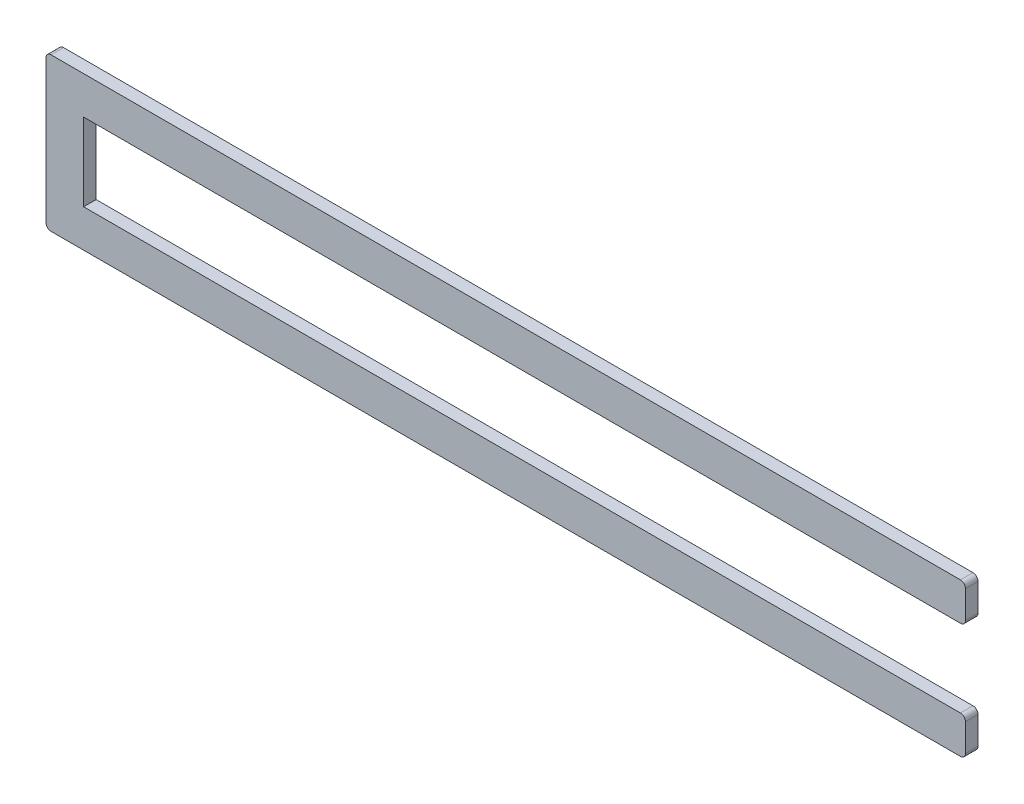
ISO-10303-21;
HEADER;
FILE_DESCRIPTION(('STEP AP214'),'2;1');
FILE_NAME('part.step','',(''),(''),'','','');
FILE_SCHEMA(('AUTOMOTIVE_DESIGN { 1 0 10303 214 1 1 1 1 }'));
ENDSEC;
DATA;
#1=APPLICATION_CONTEXT('core data for automotive mechanical design processes');
#2=APPLICATION_PROTOCOL_DEFINITION('international standard','automotive_design',2000,#1);
#3=PRODUCT_CONTEXT('',#1,'mechanical');
#4=PRODUCT('Part','Part','',(#3));
#5=PRODUCT_RELATED_PRODUCT_CATEGORY('part','',(#4));
#6=PRODUCT_DEFINITION_FORMATION('','',#4);
#7=PRODUCT_DEFINITION_CONTEXT('part definition',#1,'design');
#8=PRODUCT_DEFINITION('design','',#6,#7);
#9=PRODUCT_DEFINITION_SHAPE('','',#8);
#10=(LENGTH_UNIT() NAMED_UNIT(*) SI_UNIT(.MILLI.,.METRE.));
#11=(NAMED_UNIT(*) PLANE_ANGLE_UNIT() SI_UNIT($,.RADIAN.));
#12=(NAMED_UNIT(*) SI_UNIT($,.STERADIAN.) SOLID_ANGLE_UNIT());
#13=UNCERTAINTY_MEASURE_WITH_UNIT(LENGTH_MEASURE(1.E-05),#10,'distance_accuracy_value','');
#14=(GEOMETRIC_REPRESENTATION_CONTEXT(3) GLOBAL_UNCERTAINTY_ASSIGNED_CONTEXT((#13)) GLOBAL_UNIT_ASSIGNED_CONTEXT((#10,
#11,#12)) REPRESENTATION_CONTEXT('',''));
#15=CARTESIAN_POINT('',(0.,0.,0.));
#16=DIRECTION('',(0.,0.,1.));
#17=DIRECTION('',(1.,0.,0.));
#18=AXIS2_PLACEMENT_3D('',#15,#16,#17);
#19=CARTESIAN_POINT('',(223.393,-19.685,6.35));
#20=DIRECTION('',(-1.,0.,0.));
#21=DIRECTION('',(0.,0.,1.));
#22=AXIS2_PLACEMENT_3D('',#19,#20,#21);
#23=PLANE('',#22);
#24=DIRECTION('',(0.,1.,0.));
#25=VECTOR('',#24,1.);
#26=CARTESIAN_POINT('',(223.393,19.685,6.35));
#27=LINE('',#26,#25);
#28=CARTESIAN_POINT('',(223.393,-36.195,6.35));
#29=VERTEX_POINT('',#28);
#30=CARTESIAN_POINT('',(223.393,-22.225,6.35));
#31=VERTEX_POINT('',#30);
#32=EDGE_CURVE('E189',#29,#31,#27,.T.);
#33=ORIENTED_EDGE('',*,*,#32,.F.);
#34=DIRECTION('',(0.,0.,-1.));
#35=VECTOR('',#34,1.);
#36=CARTESIAN_POINT('',(223.393,-36.195,6.35));
#37=LINE('',#36,#35);
#38=CARTESIAN_POINT('',(223.393,-36.195,0.));
#39=VERTEX_POINT('',#38);
#40=EDGE_CURVE('E275',#29,#39,#37,.T.);
#41=ORIENTED_EDGE('',*,*,#40,.T.);
#42=DIRECTION('',(0.,1.,0.));
#43=VECTOR('',#42,1.);
#44=CARTESIAN_POINT('',(223.393,-19.685,0.));
#45=LINE('',#44,#43);
#46=CARTESIAN_POINT('',(223.393,-22.225,0.));
#47=VERTEX_POINT('',#46);
#48=EDGE_CURVE('E190',#39,#47,#45,.T.);
#49=ORIENTED_EDGE('',*,*,#48,.T.);
#50=DIRECTION('',(0.,0.,1.));
#51=VECTOR('',#50,1.);
#52=CARTESIAN_POINT('',(223.393,-22.225,6.35));
#53=LINE('',#52,#51);
#54=EDGE_CURVE('E271',#47,#31,#53,.T.);
#55=ORIENTED_EDGE('',*,*,#54,.T.);
#56=EDGE_LOOP('',(#33,#41,#49,#55));
#57=FACE_BOUND('',#56,.T.);
#58=ADVANCED_FACE('F39',(#57),#23,.F.);
#59=CARTESIAN_POINT('',(-242.443,38.735,6.35));
#60=DIRECTION('',(0.,-1.,0.));
#61=DIRECTION('',(0.,0.,-1.));
#62=AXIS2_PLACEMENT_3D('',#59,#60,#61);
#63=PLANE('',#62);
#64=DIRECTION('',(-1.,0.,0.));
#65=VECTOR('',#64,1.);
#66=CARTESIAN_POINT('',(-242.443,38.735,0.));
#67=LINE('',#66,#65);
#68=CARTESIAN_POINT('',(220.853,38.735,0.));
#69=VERTEX_POINT('',#68);
#70=CARTESIAN_POINT('',(-239.903,38.735,0.));
#71=VERTEX_POINT('',#70);
#72=EDGE_CURVE('E155',#69,#71,#67,.T.);
#73=ORIENTED_EDGE('',*,*,#72,.T.);
#74=DIRECTION('',(0.,0.,-1.));
#75=VECTOR('',#74,1.);
#76=CARTESIAN_POINT('',(-239.903,38.735,6.35));
#77=LINE('',#76,#75);
#78=CARTESIAN_POINT('',(-239.903,38.735,6.35));
#79=VERTEX_POINT('',#78);
#80=EDGE_CURVE('E55',#71,#79,#77,.F.);
#81=ORIENTED_EDGE('',*,*,#80,.T.);
#82=DIRECTION('',(-1.,0.,0.));
#83=VECTOR('',#82,1.);
#84=CARTESIAN_POINT('',(-242.443,38.735,6.35));
#85=LINE('',#84,#83);
#86=CARTESIAN_POINT('',(220.853,38.735,6.35));
#87=VERTEX_POINT('',#86);
#88=EDGE_CURVE('E191',#87,#79,#85,.T.);
#89=ORIENTED_EDGE('',*,*,#88,.F.);
#90=DIRECTION('',(0.,0.,-1.));
#91=VECTOR('',#90,1.);
#92=CARTESIAN_POINT('',(220.853,38.735,6.35));
#93=LINE('',#92,#91);
#94=EDGE_CURVE('E265',#87,#69,#93,.T.);
#95=ORIENTED_EDGE('',*,*,#94,.T.);
#96=EDGE_LOOP('',(#73,#81,#89,#95));
#97=FACE_BOUND('',#96,.T.);
#98=ADVANCED_FACE('F296',(#97),#63,.F.);
#99=CARTESIAN_POINT('',(-242.443,-38.735,6.35));
#100=DIRECTION('',(1.,0.,0.));
#101=DIRECTION('',(0.,0.,-1.));
#102=AXIS2_PLACEMENT_3D('',#99,#100,#101);
#103=PLANE('',#102);
#104=DIRECTION('',(0.,-1.,0.));
#105=VECTOR('',#104,1.);
#106=CARTESIAN_POINT('',(-242.443,-38.735,0.));
#107=LINE('',#106,#105);
#108=CARTESIAN_POINT('',(-242.443,36.195,0.));
#109=VERTEX_POINT('',#108);
#110=CARTESIAN_POINT('',(-242.443,-36.195,0.));
#111=VERTEX_POINT('',#110);
#112=EDGE_CURVE('E205',#109,#111,#107,.T.);
#113=ORIENTED_EDGE('',*,*,#112,.T.);
#114=DIRECTION('',(0.,0.,-1.));
#115=VECTOR('',#114,1.);
#116=CARTESIAN_POINT('',(-242.443,-36.195,6.35));
#117=LINE('',#116,#115);
#118=CARTESIAN_POINT('',(-242.443,-36.195,6.35));
#119=VERTEX_POINT('',#118);
#120=EDGE_CURVE('E245',#111,#119,#117,.F.);
#121=ORIENTED_EDGE('',*,*,#120,.T.);
#122=DIRECTION('',(0.,-1.,0.));
#123=VECTOR('',#122,1.);
#124=CARTESIAN_POINT('',(-242.443,-38.735,6.35));
#125=LINE('',#124,#123);
#126=CARTESIAN_POINT('',(-242.443,36.195,6.35));
#127=VERTEX_POINT('',#126);
#128=EDGE_CURVE('E194',#127,#119,#125,.T.);
#129=ORIENTED_EDGE('',*,*,#128,.F.);
#130=DIRECTION('',(0.,0.,-1.));
#131=VECTOR('',#130,1.);
#132=CARTESIAN_POINT('',(-242.443,36.195,6.35));
#133=LINE('',#132,#131);
#134=EDGE_CURVE('E241',#127,#109,#133,.T.);
#135=ORIENTED_EDGE('',*,*,#134,.T.);
#136=EDGE_LOOP('',(#113,#121,#129,#135));
#137=FACE_BOUND('',#136,.T.);
#138=ADVANCED_FACE('F304',(#137),#103,.F.);
#139=CARTESIAN_POINT('',(-242.443,-38.735,6.35));
#140=DIRECTION('',(0.,1.,0.));
#141=DIRECTION('',(0.,0.,1.));
#142=AXIS2_PLACEMENT_3D('',#139,#140,#141);
#143=PLANE('',#142);
#144=DIRECTION('',(1.,0.,0.));
#145=VECTOR('',#144,1.);
#146=CARTESIAN_POINT('',(-242.443,-38.735,6.35));
#147=LINE('',#146,#145);
#148=CARTESIAN_POINT('',(-239.903,-38.735,6.35));
#149=VERTEX_POINT('',#148);
#150=CARTESIAN_POINT('',(220.853,-38.735,6.35));
#151=VERTEX_POINT('',#150);
#152=EDGE_CURVE('E198',#149,#151,#147,.T.);
#153=ORIENTED_EDGE('',*,*,#152,.F.);
#154=DIRECTION('',(0.,0.,-1.));
#155=VECTOR('',#154,1.);
#156=CARTESIAN_POINT('',(-239.903,-38.735,6.35));
#157=LINE('',#156,#155);
#158=CARTESIAN_POINT('',(-239.903,-38.735,0.));
#159=VERTEX_POINT('',#158);
#160=EDGE_CURVE('E219',#149,#159,#157,.T.);
#161=ORIENTED_EDGE('',*,*,#160,.T.);
#162=DIRECTION('',(1.,0.,0.));
#163=VECTOR('',#162,1.);
#164=CARTESIAN_POINT('',(-242.443,-38.735,0.));
#165=LINE('',#164,#163);
#166=CARTESIAN_POINT('',(220.853,-38.735,0.));
#167=VERTEX_POINT('',#166);
#168=EDGE_CURVE('E209',#159,#167,#165,.T.);
#169=ORIENTED_EDGE('',*,*,#168,.T.);
#170=DIRECTION('',(0.,0.,-1.));
#171=VECTOR('',#170,1.);
#172=CARTESIAN_POINT('',(220.853,-38.735,6.35));
#173=LINE('',#172,#171);
#174=EDGE_CURVE('E202',#167,#151,#173,.F.);
#175=ORIENTED_EDGE('',*,*,#174,.T.);
#176=EDGE_LOOP('',(#153,#161,#169,#175));
#177=FACE_BOUND('',#176,.T.);
#178=ADVANCED_FACE('F312',(#177),#143,.F.);
#179=CARTESIAN_POINT('',(223.393,22.225,6.35));
#180=VERTEX_POINT('',#179);
#181=CARTESIAN_POINT('',(223.393,36.195,6.35));
#182=VERTEX_POINT('',#181);
#183=EDGE_CURVE('E186',#180,#182,#27,.T.);
#184=ORIENTED_EDGE('',*,*,#183,.F.);
#185=DIRECTION('',(0.,0.,1.));
#186=VECTOR('',#185,1.);
#187=CARTESIAN_POINT('',(223.393,22.225,6.35));
#188=LINE('',#187,#186);
#189=CARTESIAN_POINT('',(223.393,22.225,0.));
#190=VERTEX_POINT('',#189);
#191=EDGE_CURVE('E11',#180,#190,#188,.F.);
#192=ORIENTED_EDGE('',*,*,#191,.T.);
#193=CARTESIAN_POINT('',(223.393,36.195,0.));
#194=VERTEX_POINT('',#193);
#195=EDGE_CURVE('E213',#190,#194,#45,.T.);
#196=ORIENTED_EDGE('',*,*,#195,.T.);
#197=DIRECTION('',(0.,0.,-1.));
#198=VECTOR('',#197,1.);
#199=CARTESIAN_POINT('',(223.393,36.195,6.35));
#200=LINE('',#199,#198);
#201=EDGE_CURVE('E48',#194,#182,#200,.F.);
#202=ORIENTED_EDGE('',*,*,#201,.T.);
#203=EDGE_LOOP('',(#184,#192,#196,#202));
#204=FACE_BOUND('',#203,.T.);
#205=ADVANCED_FACE('F288',(#204),#23,.F.);
#206=CARTESIAN_POINT('',(0.,0.,6.35));
#207=DIRECTION('',(0.,0.,-1.));
#208=DIRECTION('',(-1.,0.,0.));
#209=AXIS2_PLACEMENT_3D('',#206,#207,#208);
#210=PLANE('',#209);
#211=ORIENTED_EDGE('',*,*,#128,.T.);
#212=CARTESIAN_POINT('',(-239.903,-36.195,6.35));
#213=DIRECTION('',(0.,0.,-1.));
#214=DIRECTION('',(-1.,0.,0.));
#215=AXIS2_PLACEMENT_3D('',#212,#213,#214);
#216=CIRCLE('',#215,2.54);
#217=EDGE_CURVE('E262',#119,#149,#216,.F.);
#218=ORIENTED_EDGE('',*,*,#217,.T.);
#219=ORIENTED_EDGE('',*,*,#152,.T.);
#220=CARTESIAN_POINT('',(220.853,-36.195,6.35));
#221=DIRECTION('',(0.,0.,-1.));
#222=DIRECTION('',(-1.,0.,0.));
#223=AXIS2_PLACEMENT_3D('',#220,#221,#222);
#224=CIRCLE('',#223,2.54);
#225=EDGE_CURVE('E256',#151,#29,#224,.F.);
#226=ORIENTED_EDGE('',*,*,#225,.T.);
#227=ORIENTED_EDGE('',*,*,#32,.T.);
#228=CARTESIAN_POINT('',(220.853,-22.225,6.35));
#229=DIRECTION('',(0.,0.,-1.));
#230=DIRECTION('',(-1.,0.,0.));
#231=AXIS2_PLACEMENT_3D('',#228,#229,#230);
#232=CIRCLE('',#231,2.54);
#233=CARTESIAN_POINT('',(220.853,-19.685,6.35));
#234=VERTEX_POINT('',#233);
#235=EDGE_CURVE('E253',#31,#234,#232,.F.);
#236=ORIENTED_EDGE('',*,*,#235,.T.);
#237=DIRECTION('',(1.,0.,0.));
#238=VECTOR('',#237,1.);
#239=CARTESIAN_POINT('',(223.393,-19.685,6.35));
#240=LINE('',#239,#238);
#241=CARTESIAN_POINT('',(-223.393,-19.6850000000001,6.35));
#242=VERTEX_POINT('',#241);
#243=EDGE_CURVE('E174',#242,#234,#240,.T.);
#244=ORIENTED_EDGE('',*,*,#243,.F.);
#245=DIRECTION('',(0.,-1.,0.));
#246=VECTOR('',#245,1.);
#247=CARTESIAN_POINT('',(-223.393,-19.6850000000001,6.35));
#248=LINE('',#247,#246);
#249=CARTESIAN_POINT('',(-223.393,19.6850000000001,6.35));
#250=VERTEX_POINT('',#249);
#251=EDGE_CURVE('E150',#250,#242,#248,.T.);
#252=ORIENTED_EDGE('',*,*,#251,.F.);
#253=DIRECTION('',(-1.,0.,0.));
#254=VECTOR('',#253,1.);
#255=CARTESIAN_POINT('',(223.393,19.685,6.35));
#256=LINE('',#255,#254);
#257=CARTESIAN_POINT('',(220.853,19.685,6.35));
#258=VERTEX_POINT('',#257);
#259=EDGE_CURVE('E177',#258,#250,#256,.T.);
#260=ORIENTED_EDGE('',*,*,#259,.F.);
#261=CARTESIAN_POINT('',(220.853,22.225,6.35));
#262=DIRECTION('',(0.,0.,-1.));
#263=DIRECTION('',(-1.,0.,0.));
#264=AXIS2_PLACEMENT_3D('',#261,#262,#263);
#265=CIRCLE('',#264,2.54);
#266=EDGE_CURVE('E250',#258,#180,#265,.F.);
#267=ORIENTED_EDGE('',*,*,#266,.T.);
#268=ORIENTED_EDGE('',*,*,#183,.T.);
#269=CARTESIAN_POINT('',(220.853,36.195,6.35));
#270=DIRECTION('',(0.,0.,-1.));
#271=DIRECTION('',(-1.,0.,0.));
#272=AXIS2_PLACEMENT_3D('',#269,#270,#271);
#273=CIRCLE('',#272,2.54);
#274=EDGE_CURVE('E62',#182,#87,#273,.F.);
#275=ORIENTED_EDGE('',*,*,#274,.T.);
#276=ORIENTED_EDGE('',*,*,#88,.T.);
#277=CARTESIAN_POINT('',(-239.903,36.195,6.35));
#278=DIRECTION('',(0.,0.,-1.));
#279=DIRECTION('',(-1.,0.,0.));
#280=AXIS2_PLACEMENT_3D('',#277,#278,#279);
#281=CIRCLE('',#280,2.54);
#282=EDGE_CURVE('E259',#79,#127,#281,.F.);
#283=ORIENTED_EDGE('',*,*,#282,.T.);
#284=EDGE_LOOP('',(#211,#218,#219,#226,#227,#236,#244,#252,#260,#267,#268,#275,#276,#283));
#285=FACE_BOUND('',#284,.T.);
#286=ADVANCED_FACE('F292',(#285),#210,.F.);
#287=CARTESIAN_POINT('',(0.,0.,0.));
#288=DIRECTION('',(0.,0.,-1.));
#289=DIRECTION('',(-1.,0.,0.));
#290=AXIS2_PLACEMENT_3D('',#287,#288,#289);
#291=PLANE('',#290);
#292=ORIENTED_EDGE('',*,*,#168,.F.);
#293=CARTESIAN_POINT('',(-239.903,-36.195,0.));
#294=DIRECTION('',(0.,0.,-1.));
#295=DIRECTION('',(-1.,0.,0.));
#296=AXIS2_PLACEMENT_3D('',#293,#294,#295);
#297=CIRCLE('',#296,2.54);
#298=EDGE_CURVE('E238',#159,#111,#297,.T.);
#299=ORIENTED_EDGE('',*,*,#298,.T.);
#300=ORIENTED_EDGE('',*,*,#112,.F.);
#301=CARTESIAN_POINT('',(-239.903,36.195,0.));
#302=DIRECTION('',(0.,0.,-1.));
#303=DIRECTION('',(-1.,0.,0.));
#304=AXIS2_PLACEMENT_3D('',#301,#302,#303);
#305=CIRCLE('',#304,2.54);
#306=EDGE_CURVE('E235',#109,#71,#305,.T.);
#307=ORIENTED_EDGE('',*,*,#306,.T.);
#308=ORIENTED_EDGE('',*,*,#72,.F.);
#309=CARTESIAN_POINT('',(220.853,36.195,0.));
#310=DIRECTION('',(0.,0.,-1.));
#311=DIRECTION('',(-1.,0.,0.));
#312=AXIS2_PLACEMENT_3D('',#309,#310,#311);
#313=CIRCLE('',#312,2.54);
#314=EDGE_CURVE('E223',#69,#194,#313,.T.);
#315=ORIENTED_EDGE('',*,*,#314,.T.);
#316=ORIENTED_EDGE('',*,*,#195,.F.);
#317=CARTESIAN_POINT('',(220.853,22.225,0.));
#318=DIRECTION('',(0.,0.,-1.));
#319=DIRECTION('',(-1.,0.,0.));
#320=AXIS2_PLACEMENT_3D('',#317,#318,#319);
#321=CIRCLE('',#320,2.54);
#322=CARTESIAN_POINT('',(220.853,19.685,0.));
#323=VERTEX_POINT('',#322);
#324=EDGE_CURVE('E226',#190,#323,#321,.T.);
#325=ORIENTED_EDGE('',*,*,#324,.T.);
#326=DIRECTION('',(-1.,0.,0.));
#327=VECTOR('',#326,1.);
#328=CARTESIAN_POINT('',(223.393,19.685,0.));
#329=LINE('',#328,#327);
#330=CARTESIAN_POINT('',(-223.393,19.6850000000001,0.));
#331=VERTEX_POINT('',#330);
#332=EDGE_CURVE('E170',#323,#331,#329,.T.);
#333=ORIENTED_EDGE('',*,*,#332,.T.);
#334=DIRECTION('',(0.,-1.,0.));
#335=VECTOR('',#334,1.);
#336=CARTESIAN_POINT('',(-223.393,-19.6850000000001,0.));
#337=LINE('',#336,#335);
#338=CARTESIAN_POINT('',(-223.393,-19.6850000000001,0.));
#339=VERTEX_POINT('',#338);
#340=EDGE_CURVE('E147',#331,#339,#337,.T.);
#341=ORIENTED_EDGE('',*,*,#340,.T.);
#342=DIRECTION('',(1.,0.,0.));
#343=VECTOR('',#342,1.);
#344=CARTESIAN_POINT('',(223.393,-19.685,0.));
#345=LINE('',#344,#343);
#346=CARTESIAN_POINT('',(220.853,-19.685,0.));
#347=VERTEX_POINT('',#346);
#348=EDGE_CURVE('E159',#339,#347,#345,.T.);
#349=ORIENTED_EDGE('',*,*,#348,.T.);
#350=CARTESIAN_POINT('',(220.853,-22.225,0.));
#351=DIRECTION('',(0.,0.,-1.));
#352=DIRECTION('',(-1.,0.,0.));
#353=AXIS2_PLACEMENT_3D('',#350,#351,#352);
#354=CIRCLE('',#353,2.54);
#355=EDGE_CURVE('E229',#347,#47,#354,.T.);
#356=ORIENTED_EDGE('',*,*,#355,.T.);
#357=ORIENTED_EDGE('',*,*,#48,.F.);
#358=CARTESIAN_POINT('',(220.853,-36.195,0.));
#359=DIRECTION('',(0.,0.,-1.));
#360=DIRECTION('',(-1.,0.,0.));
#361=AXIS2_PLACEMENT_3D('',#358,#359,#360);
#362=CIRCLE('',#361,2.54);
#363=EDGE_CURVE('E232',#39,#167,#362,.T.);
#364=ORIENTED_EDGE('',*,*,#363,.T.);
#365=EDGE_LOOP('',(#292,#299,#300,#307,#308,#315,#316,#325,#333,#341,#349,#356,#357,#364));
#366=FACE_BOUND('',#365,.T.);
#367=ADVANCED_FACE('F168',(#366),#291,.T.);
#368=CARTESIAN_POINT('',(223.393,-19.685,0.));
#369=DIRECTION('',(0.,-1.,0.));
#370=DIRECTION('',(1.,0.,0.));
#371=AXIS2_PLACEMENT_3D('',#368,#369,#370);
#372=PLANE('',#371);
#373=ORIENTED_EDGE('',*,*,#243,.T.);
#374=DIRECTION('',(0.,0.,1.));
#375=VECTOR('',#374,1.);
#376=CARTESIAN_POINT('',(220.853,-19.685,0.));
#377=LINE('',#376,#375);
#378=EDGE_CURVE('E162',#234,#347,#377,.F.);
#379=ORIENTED_EDGE('',*,*,#378,.T.);
#380=ORIENTED_EDGE('',*,*,#348,.F.);
#381=DIRECTION('',(0.,0.,1.));
#382=VECTOR('',#381,1.);
#383=CARTESIAN_POINT('',(-223.393,-19.6850000000001,0.));
#384=LINE('',#383,#382);
#385=EDGE_CURVE('E142',#339,#242,#384,.T.);
#386=ORIENTED_EDGE('',*,*,#385,.T.);
#387=EDGE_LOOP('',(#373,#379,#380,#386));
#388=FACE_BOUND('',#387,.T.);
#389=ADVANCED_FACE('F160',(#388),#372,.F.);
#390=CARTESIAN_POINT('',(-223.393,-19.6850000000001,0.));
#391=DIRECTION('',(-1.,0.,0.));
#392=DIRECTION('',(0.,0.,1.));
#393=AXIS2_PLACEMENT_3D('',#390,#391,#392);
#394=PLANE('',#393);
#395=ORIENTED_EDGE('',*,*,#251,.T.);
#396=ORIENTED_EDGE('',*,*,#385,.F.);
#397=ORIENTED_EDGE('',*,*,#340,.F.);
#398=DIRECTION('',(0.,0.,1.));
#399=VECTOR('',#398,1.);
#400=CARTESIAN_POINT('',(-223.393,19.6850000000001,0.));
#401=LINE('',#400,#399);
#402=EDGE_CURVE('E156',#331,#250,#401,.T.);
#403=ORIENTED_EDGE('',*,*,#402,.T.);
#404=EDGE_LOOP('',(#395,#396,#397,#403));
#405=FACE_BOUND('',#404,.T.);
#406=ADVANCED_FACE('F144',(#405),#394,.F.);
#407=CARTESIAN_POINT('',(223.393,19.685,0.));
#408=DIRECTION('',(0.,1.,0.));
#409=DIRECTION('',(-1.,0.,0.));
#410=AXIS2_PLACEMENT_3D('',#407,#408,#409);
#411=PLANE('',#410);
#412=ORIENTED_EDGE('',*,*,#332,.F.);
#413=DIRECTION('',(0.,0.,1.));
#414=VECTOR('',#413,1.);
#415=CARTESIAN_POINT('',(220.853,19.685,0.));
#416=LINE('',#415,#414);
#417=EDGE_CURVE('E281',#323,#258,#416,.T.);
#418=ORIENTED_EDGE('',*,*,#417,.T.);
#419=ORIENTED_EDGE('',*,*,#259,.T.);
#420=ORIENTED_EDGE('',*,*,#402,.F.);
#421=EDGE_LOOP('',(#412,#418,#419,#420));
#422=FACE_BOUND('',#421,.T.);
#423=ADVANCED_FACE('F358',(#422),#411,.F.);
#424=CARTESIAN_POINT('',(-239.903,-36.195,6.35));
#425=DIRECTION('',(0.,0.,-1.));
#426=DIRECTION('',(-1.,0.,0.));
#427=AXIS2_PLACEMENT_3D('',#424,#425,#426);
#428=CYLINDRICAL_SURFACE('',#427,2.54);
#429=ORIENTED_EDGE('',*,*,#217,.F.);
#430=ORIENTED_EDGE('',*,*,#120,.F.);
#431=ORIENTED_EDGE('',*,*,#298,.F.);
#432=ORIENTED_EDGE('',*,*,#160,.F.);
#433=EDGE_LOOP('',(#429,#430,#431,#432));
#434=FACE_BOUND('',#433,.T.);
#435=ADVANCED_FACE('F310',(#434),#428,.T.);
#436=CARTESIAN_POINT('',(-239.903,36.195,6.35));
#437=DIRECTION('',(0.,0.,-1.));
#438=DIRECTION('',(-1.,0.,0.));
#439=AXIS2_PLACEMENT_3D('',#436,#437,#438);
#440=CYLINDRICAL_SURFACE('',#439,2.54);
#441=ORIENTED_EDGE('',*,*,#282,.F.);
#442=ORIENTED_EDGE('',*,*,#80,.F.);
#443=ORIENTED_EDGE('',*,*,#306,.F.);
#444=ORIENTED_EDGE('',*,*,#134,.F.);
#445=EDGE_LOOP('',(#441,#442,#443,#444));
#446=FACE_BOUND('',#445,.T.);
#447=ADVANCED_FACE('F301',(#446),#440,.T.);
#448=CARTESIAN_POINT('',(220.853,-36.195,6.35));
#449=DIRECTION('',(0.,0.,-1.));
#450=DIRECTION('',(-1.,0.,0.));
#451=AXIS2_PLACEMENT_3D('',#448,#449,#450);
#452=CYLINDRICAL_SURFACE('',#451,2.54);
#453=ORIENTED_EDGE('',*,*,#225,.F.);
#454=ORIENTED_EDGE('',*,*,#174,.F.);
#455=ORIENTED_EDGE('',*,*,#363,.F.);
#456=ORIENTED_EDGE('',*,*,#40,.F.);
#457=EDGE_LOOP('',(#453,#454,#455,#456));
#458=FACE_BOUND('',#457,.T.);
#459=ADVANCED_FACE('F319',(#458),#452,.T.);
#460=CARTESIAN_POINT('',(220.853,-22.225,6.35));
#461=DIRECTION('',(0.,0.,1.));
#462=DIRECTION('',(1.,0.,0.));
#463=AXIS2_PLACEMENT_3D('',#460,#461,#462);
#464=CYLINDRICAL_SURFACE('',#463,2.54);
#465=ORIENTED_EDGE('',*,*,#355,.F.);
#466=ORIENTED_EDGE('',*,*,#378,.F.);
#467=ORIENTED_EDGE('',*,*,#235,.F.);
#468=ORIENTED_EDGE('',*,*,#54,.F.);
#469=EDGE_LOOP('',(#465,#466,#467,#468));
#470=FACE_BOUND('',#469,.T.);
#471=ADVANCED_FACE('F327',(#470),#464,.T.);
#472=CARTESIAN_POINT('',(220.853,22.225,0.));
#473=DIRECTION('',(0.,0.,1.));
#474=DIRECTION('',(1.,0.,0.));
#475=AXIS2_PLACEMENT_3D('',#472,#473,#474);
#476=CYLINDRICAL_SURFACE('',#475,2.54);
#477=ORIENTED_EDGE('',*,*,#324,.F.);
#478=ORIENTED_EDGE('',*,*,#191,.F.);
#479=ORIENTED_EDGE('',*,*,#266,.F.);
#480=ORIENTED_EDGE('',*,*,#417,.F.);
#481=EDGE_LOOP('',(#477,#478,#479,#480));
#482=FACE_BOUND('',#481,.T.);
#483=ADVANCED_FACE('F329',(#482),#476,.T.);
#484=CARTESIAN_POINT('',(220.853,36.195,6.35));
#485=DIRECTION('',(0.,0.,-1.));
#486=DIRECTION('',(-1.,0.,0.));
#487=AXIS2_PLACEMENT_3D('',#484,#485,#486);
#488=CYLINDRICAL_SURFACE('',#487,2.54);
#489=ORIENTED_EDGE('',*,*,#274,.F.);
#490=ORIENTED_EDGE('',*,*,#201,.F.);
#491=ORIENTED_EDGE('',*,*,#314,.F.);
#492=ORIENTED_EDGE('',*,*,#94,.F.);
#493=EDGE_LOOP('',(#489,#490,#491,#492));
#494=FACE_BOUND('',#493,.T.);
#495=ADVANCED_FACE('F41',(#494),#488,.T.);
#496=CLOSED_SHELL('',(#58,#98,#138,#178,#205,#286,#367,#389,#406,#423,#435,#447,#459,#471,#483,#495));
#497=MANIFOLD_SOLID_BREP('B2',#496);
#498=ADVANCED_BREP_SHAPE_REPRESENTATION('',(#18,#497),#14);
#499=SHAPE_DEFINITION_REPRESENTATION(#9,#498);
ENDSEC;
END-ISO-10303-21;
